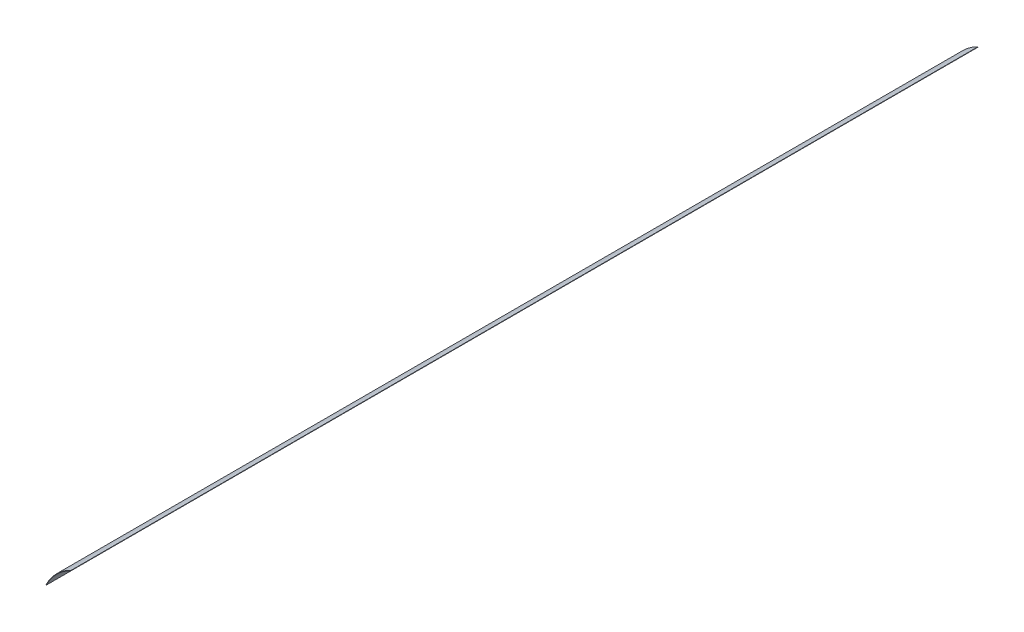
ISO-10303-21;
HEADER;
FILE_DESCRIPTION(('STEP AP214'),'2;1');
FILE_NAME('part.step','',(''),(''),'','','');
FILE_SCHEMA(('AUTOMOTIVE_DESIGN { 1 0 10303 214 1 1 1 1 }'));
ENDSEC;
DATA;
#1=APPLICATION_CONTEXT('core data for automotive mechanical design processes');
#2=APPLICATION_PROTOCOL_DEFINITION('international standard','automotive_design',2000,#1);
#3=PRODUCT_CONTEXT('',#1,'mechanical');
#4=PRODUCT('Part','Part','',(#3));
#5=PRODUCT_RELATED_PRODUCT_CATEGORY('part','',(#4));
#6=PRODUCT_DEFINITION_FORMATION('','',#4);
#7=PRODUCT_DEFINITION_CONTEXT('part definition',#1,'design');
#8=PRODUCT_DEFINITION('design','',#6,#7);
#9=PRODUCT_DEFINITION_SHAPE('','',#8);
#10=(LENGTH_UNIT() NAMED_UNIT(*) SI_UNIT(.MILLI.,.METRE.));
#11=(NAMED_UNIT(*) PLANE_ANGLE_UNIT() SI_UNIT($,.RADIAN.));
#12=(NAMED_UNIT(*) SI_UNIT($,.STERADIAN.) SOLID_ANGLE_UNIT());
#13=UNCERTAINTY_MEASURE_WITH_UNIT(LENGTH_MEASURE(1.E-05),#10,'distance_accuracy_value','');
#14=(GEOMETRIC_REPRESENTATION_CONTEXT(3) GLOBAL_UNCERTAINTY_ASSIGNED_CONTEXT((#13)) GLOBAL_UNIT_ASSIGNED_CONTEXT((#10,
#11,#12)) REPRESENTATION_CONTEXT('',''));
#15=CARTESIAN_POINT('',(0.,0.,0.));
#16=DIRECTION('',(0.,0.,1.));
#17=DIRECTION('',(1.,0.,0.));
#18=AXIS2_PLACEMENT_3D('',#15,#16,#17);
#19=CARTESIAN_POINT('',(-733.710372437994,195.441983667908,-768.380431195113));
#20=DIRECTION('',(0.,0.,-1.));
#21=DIRECTION('',(-1.,0.,0.));
#22=AXIS2_PLACEMENT_3D('',#19,#20,#21);
#23=PLANE('',#22);
#24=DIRECTION('',(-0.707106781186514,0.707106781186581,0.));
#25=VECTOR('',#24,1.);
#26=CARTESIAN_POINT('',(-840.059042566693,67.5107038333882,-768.380431195113));
#27=LINE('',#26,#25);
#28=CARTESIAN_POINT('',(-840.059042566693,67.5107038333882,-768.380431195113));
#29=VERTEX_POINT('',#28);
#30=CARTESIAN_POINT('',(-839.909091490419,67.360752757114,-768.380431195113));
#31=VERTEX_POINT('',#30);
#32=EDGE_CURVE('E61',#29,#31,#27,.F.);
#33=ORIENTED_EDGE('',*,*,#32,.F.);
#34=CARTESIAN_POINT('',(-823.489347611488,32.9804966360449,-768.380431195113));
#35=DIRECTION('',(0.,0.,1.));
#36=DIRECTION('',(1.,0.,0.));
#37=AXIS2_PLACEMENT_3D('',#34,#35,#36);
#38=CIRCLE('',#37,38.3);
#39=CARTESIAN_POINT('',(-858.019554808831,49.5501915912499,-768.380431195113));
#40=VERTEX_POINT('',#39);
#41=EDGE_CURVE('E20',#40,#29,#38,.F.);
#42=ORIENTED_EDGE('',*,*,#41,.F.);
#43=DIRECTION('',(-0.707106781186089,0.707106781187006,0.));
#44=VECTOR('',#43,1.);
#45=CARTESIAN_POINT('',(-857.869603732557,49.4002405149757,-768.380431195113));
#46=LINE('',#45,#44);
#47=CARTESIAN_POINT('',(-857.869603732557,49.4002405149758,-768.380431195113));
#48=VERTEX_POINT('',#47);
#49=EDGE_CURVE('E72',#48,#40,#46,.T.);
#50=ORIENTED_EDGE('',*,*,#49,.F.);
#51=CARTESIAN_POINT('',(-823.489347611488,32.9804966360449,-768.380431195113));
#52=DIRECTION('',(0.,0.,1.));
#53=DIRECTION('',(1.,0.,0.));
#54=AXIS2_PLACEMENT_3D('',#51,#52,#53);
#55=CIRCLE('',#54,38.1);
#56=EDGE_CURVE('E74',#48,#31,#55,.F.);
#57=ORIENTED_EDGE('',*,*,#56,.T.);
#58=EDGE_LOOP('',(#33,#42,#50,#57));
#59=FACE_BOUND('',#58,.T.);
#60=ADVANCED_FACE('F17',(#59),#23,.F.);
#61=CARTESIAN_POINT('',(-823.489347611488,32.9804966360449,-1415.13043119511));
#62=DIRECTION('',(0.,0.,1.));
#63=DIRECTION('',(1.,0.,0.));
#64=AXIS2_PLACEMENT_3D('',#61,#62,#63);
#65=CYLINDRICAL_SURFACE('',#64,38.3);
#66=ORIENTED_EDGE('',*,*,#41,.T.);
#67=DIRECTION('',(0.,0.,1.));
#68=VECTOR('',#67,1.);
#69=CARTESIAN_POINT('',(-840.059042566693,67.5107038333882,-1415.13043119511));
#70=LINE('',#69,#68);
#71=CARTESIAN_POINT('',(-840.059042566693,67.5107038333882,-1415.13043119511));
#72=VERTEX_POINT('',#71);
#73=EDGE_CURVE('E58',#72,#29,#70,.T.);
#74=ORIENTED_EDGE('',*,*,#73,.F.);
#75=CARTESIAN_POINT('',(-823.489347611488,32.9804966360449,-1415.13043119511));
#76=DIRECTION('',(0.,0.,1.));
#77=DIRECTION('',(1.,0.,0.));
#78=AXIS2_PLACEMENT_3D('',#75,#76,#77);
#79=CIRCLE('',#78,38.3);
#80=CARTESIAN_POINT('',(-858.019554808831,49.5501915912496,-1415.13043119511));
#81=VERTEX_POINT('',#80);
#82=EDGE_CURVE('E86',#72,#81,#79,.T.);
#83=ORIENTED_EDGE('',*,*,#82,.T.);
#84=DIRECTION('',(0.,0.,1.));
#85=VECTOR('',#84,1.);
#86=CARTESIAN_POINT('',(-858.019554808831,49.5501915912498,-1415.13043119511));
#87=LINE('',#86,#85);
#88=EDGE_CURVE('E55',#40,#81,#87,.F.);
#89=ORIENTED_EDGE('',*,*,#88,.F.);
#90=EDGE_LOOP('',(#66,#74,#83,#89));
#91=FACE_BOUND('',#90,.T.);
#92=ADVANCED_FACE('F67',(#91),#65,.T.);
#93=CARTESIAN_POINT('',(-857.869603732557,49.4002405149757,-1415.13043119511));
#94=DIRECTION('',(-0.707106781186581,-0.707106781186514,0.));
#95=DIRECTION('',(0.707106781186514,-0.707106781186581,0.));
#96=AXIS2_PLACEMENT_3D('',#93,#94,#95);
#97=PLANE('',#96);
#98=DIRECTION('',(0.,0.,1.));
#99=VECTOR('',#98,1.);
#100=CARTESIAN_POINT('',(-857.869603732557,49.4002405149758,-1415.13043119511));
#101=LINE('',#100,#99);
#102=CARTESIAN_POINT('',(-857.869603732557,49.4002405149758,-1415.13043119511));
#103=VERTEX_POINT('',#102);
#104=EDGE_CURVE('E91',#103,#48,#101,.T.);
#105=ORIENTED_EDGE('',*,*,#104,.T.);
#106=ORIENTED_EDGE('',*,*,#49,.T.);
#107=ORIENTED_EDGE('',*,*,#88,.T.);
#108=DIRECTION('',(0.707106781188723,-0.707106781184372,0.));
#109=VECTOR('',#108,1.);
#110=CARTESIAN_POINT('',(-858.019554808832,49.5501915912498,-1415.13043119511));
#111=LINE('',#110,#109);
#112=EDGE_CURVE('E88',#81,#103,#111,.T.);
#113=ORIENTED_EDGE('',*,*,#112,.T.);
#114=EDGE_LOOP('',(#105,#106,#107,#113));
#115=FACE_BOUND('',#114,.T.);
#116=ADVANCED_FACE('F107',(#115),#97,.T.);
#117=CARTESIAN_POINT('',(-840.059042566693,67.5107038333882,-1415.13043119511));
#118=DIRECTION('',(0.707106781186581,0.707106781186514,0.));
#119=DIRECTION('',(-0.707106781186514,0.707106781186581,0.));
#120=AXIS2_PLACEMENT_3D('',#117,#118,#119);
#121=PLANE('',#120);
#122=ORIENTED_EDGE('',*,*,#73,.T.);
#123=ORIENTED_EDGE('',*,*,#32,.T.);
#124=DIRECTION('',(0.,0.,1.));
#125=VECTOR('',#124,1.);
#126=CARTESIAN_POINT('',(-839.909091490419,67.360752757114,-1415.13043119511));
#127=LINE('',#126,#125);
#128=CARTESIAN_POINT('',(-839.909091490419,67.360752757114,-1415.13043119511));
#129=VERTEX_POINT('',#128);
#130=EDGE_CURVE('E27',#31,#129,#127,.F.);
#131=ORIENTED_EDGE('',*,*,#130,.T.);
#132=DIRECTION('',(-0.707106781186122,0.707106781186973,0.));
#133=VECTOR('',#132,1.);
#134=CARTESIAN_POINT('',(-839.909091490419,67.360752757114,-1415.13043119511));
#135=LINE('',#134,#133);
#136=EDGE_CURVE('E63',#129,#72,#135,.T.);
#137=ORIENTED_EDGE('',*,*,#136,.T.);
#138=EDGE_LOOP('',(#122,#123,#131,#137));
#139=FACE_BOUND('',#138,.T.);
#140=ADVANCED_FACE('F59',(#139),#121,.T.);
#141=CARTESIAN_POINT('',(-823.489347611488,-0.119503363955232,-1415.13043119511));
#142=DIRECTION('',(0.,0.,1.));
#143=DIRECTION('',(1.,0.,0.));
#144=AXIS2_PLACEMENT_3D('',#141,#142,#143);
#145=PLANE('',#144);
#146=ORIENTED_EDGE('',*,*,#112,.F.);
#147=ORIENTED_EDGE('',*,*,#82,.F.);
#148=ORIENTED_EDGE('',*,*,#136,.F.);
#149=CARTESIAN_POINT('',(-823.489347611488,32.9804966360449,-1415.13043119511));
#150=DIRECTION('',(0.,0.,1.));
#151=DIRECTION('',(1.,0.,0.));
#152=AXIS2_PLACEMENT_3D('',#149,#150,#151);
#153=CIRCLE('',#152,38.1);
#154=EDGE_CURVE('E11',#129,#103,#153,.T.);
#155=ORIENTED_EDGE('',*,*,#154,.T.);
#156=EDGE_LOOP('',(#146,#147,#148,#155));
#157=FACE_BOUND('',#156,.T.);
#158=ADVANCED_FACE('F109',(#157),#145,.F.);
#159=CARTESIAN_POINT('',(-823.489347611488,32.9804966360449,-1415.13043119511));
#160=DIRECTION('',(0.,0.,1.));
#161=DIRECTION('',(1.,0.,0.));
#162=AXIS2_PLACEMENT_3D('',#159,#160,#161);
#163=CYLINDRICAL_SURFACE('',#162,38.1);
#164=ORIENTED_EDGE('',*,*,#154,.F.);
#165=ORIENTED_EDGE('',*,*,#130,.F.);
#166=ORIENTED_EDGE('',*,*,#56,.F.);
#167=ORIENTED_EDGE('',*,*,#104,.F.);
#168=EDGE_LOOP('',(#164,#165,#166,#167));
#169=FACE_BOUND('',#168,.T.);
#170=ADVANCED_FACE('F112',(#169),#163,.F.);
#171=CLOSED_SHELL('',(#60,#92,#116,#140,#158,#170));
#172=MANIFOLD_SOLID_BREP('B1',#171);
#173=ADVANCED_BREP_SHAPE_REPRESENTATION('',(#18,#172),#14);
#174=SHAPE_DEFINITION_REPRESENTATION(#9,#173);
ENDSEC;
END-ISO-10303-21;
